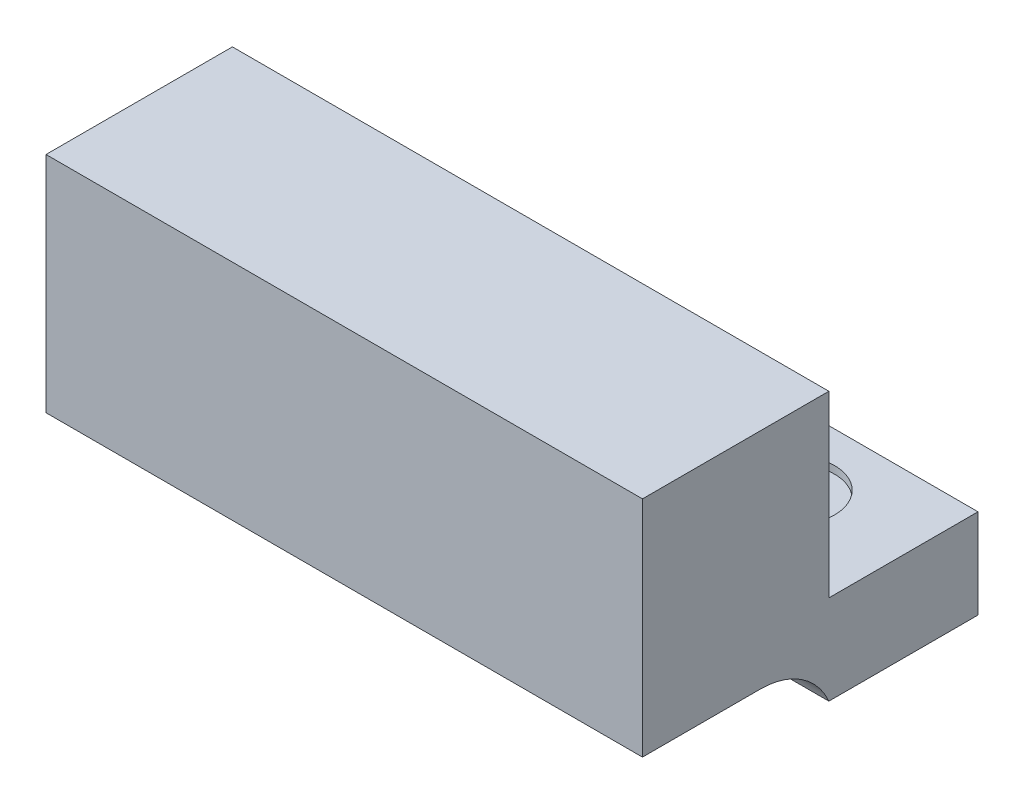
ISO-10303-21;
HEADER;
FILE_DESCRIPTION(('STEP AP214'),'2;1');
FILE_NAME('part.step','',(''),(''),'','','');
FILE_SCHEMA(('AUTOMOTIVE_DESIGN { 1 0 10303 214 1 1 1 1 }'));
ENDSEC;
DATA;
#1=APPLICATION_CONTEXT('core data for automotive mechanical design processes');
#2=APPLICATION_PROTOCOL_DEFINITION('international standard','automotive_design',2000,#1);
#3=PRODUCT_CONTEXT('',#1,'mechanical');
#4=PRODUCT('Part','Part','',(#3));
#5=PRODUCT_RELATED_PRODUCT_CATEGORY('part','',(#4));
#6=PRODUCT_DEFINITION_FORMATION('','',#4);
#7=PRODUCT_DEFINITION_CONTEXT('part definition',#1,'design');
#8=PRODUCT_DEFINITION('design','',#6,#7);
#9=PRODUCT_DEFINITION_SHAPE('','',#8);
#10=(LENGTH_UNIT() NAMED_UNIT(*) SI_UNIT(.MILLI.,.METRE.));
#11=(NAMED_UNIT(*) PLANE_ANGLE_UNIT() SI_UNIT($,.RADIAN.));
#12=(NAMED_UNIT(*) SI_UNIT($,.STERADIAN.) SOLID_ANGLE_UNIT());
#13=UNCERTAINTY_MEASURE_WITH_UNIT(LENGTH_MEASURE(1.E-05),#10,'distance_accuracy_value','');
#14=(GEOMETRIC_REPRESENTATION_CONTEXT(3) GLOBAL_UNCERTAINTY_ASSIGNED_CONTEXT((#13)) GLOBAL_UNIT_ASSIGNED_CONTEXT((#10,
#11,#12)) REPRESENTATION_CONTEXT('',''));
#15=CARTESIAN_POINT('',(0.,0.,0.));
#16=DIRECTION('',(0.,0.,1.));
#17=DIRECTION('',(1.,0.,0.));
#18=AXIS2_PLACEMENT_3D('',#15,#16,#17);
#19=CARTESIAN_POINT('',(0.,17.88424326,-20.));
#20=DIRECTION('',(0.,1.,0.));
#21=DIRECTION('',(0.,0.,1.));
#22=AXIS2_PLACEMENT_3D('',#19,#20,#21);
#23=PLANE('',#22);
#24=CARTESIAN_POINT('',(-9.08830476000388,17.88424326,-10.));
#25=DIRECTION('',(0.,-1.,0.));
#26=DIRECTION('',(0.,0.,-1.));
#27=AXIS2_PLACEMENT_3D('',#24,#25,#26);
#28=CIRCLE('',#27,3.);
#29=CARTESIAN_POINT('',(-9.08830476000388,17.88424326,-13.));
#30=VERTEX_POINT('',#29);
#31=EDGE_CURVE('E305',#30,#30,#28,.T.);
#32=ORIENTED_EDGE('',*,*,#31,.F.);
#33=EDGE_LOOP('',(#32));
#34=FACE_BOUND('',#33,.T.);
#35=CARTESIAN_POINT('',(5.91169523999612,17.88424326,-10.));
#36=DIRECTION('',(0.,-1.,0.));
#37=DIRECTION('',(0.,0.,-1.));
#38=AXIS2_PLACEMENT_3D('',#35,#36,#37);
#39=CIRCLE('',#38,2.99999999999999);
#40=CARTESIAN_POINT('',(5.91169523999612,17.88424326,-13.));
#41=VERTEX_POINT('',#40);
#42=EDGE_CURVE('E311',#41,#41,#39,.T.);
#43=ORIENTED_EDGE('',*,*,#42,.F.);
#44=EDGE_LOOP('',(#43));
#45=FACE_BOUND('',#44,.T.);
#46=DIRECTION('',(-1.,0.,0.));
#47=VECTOR('',#46,1.);
#48=CARTESIAN_POINT('',(0.,17.88424326,0.));
#49=LINE('',#48,#47);
#50=CARTESIAN_POINT('',(20.9116952399961,17.88424326,0.));
#51=VERTEX_POINT('',#50);
#52=CARTESIAN_POINT('',(-59.0883047600039,17.88424326,0.));
#53=VERTEX_POINT('',#52);
#54=EDGE_CURVE('E135',#51,#53,#49,.T.);
#55=ORIENTED_EDGE('',*,*,#54,.T.);
#56=DIRECTION('',(0.,0.,1.));
#57=VECTOR('',#56,1.);
#58=CARTESIAN_POINT('',(-59.0883047600039,17.88424326,-20.));
#59=LINE('',#58,#57);
#60=CARTESIAN_POINT('',(-59.0883047600039,17.88424326,-20.));
#61=VERTEX_POINT('',#60);
#62=EDGE_CURVE('E153',#61,#53,#59,.T.);
#63=ORIENTED_EDGE('',*,*,#62,.F.);
#64=DIRECTION('',(-1.,0.,0.));
#65=VECTOR('',#64,1.);
#66=CARTESIAN_POINT('',(0.,17.88424326,-20.));
#67=LINE('',#66,#65);
#68=CARTESIAN_POINT('',(20.9116952399961,17.88424326,-20.));
#69=VERTEX_POINT('',#68);
#70=EDGE_CURVE('E128',#69,#61,#67,.T.);
#71=ORIENTED_EDGE('',*,*,#70,.F.);
#72=DIRECTION('',(0.,0.,1.));
#73=VECTOR('',#72,1.);
#74=CARTESIAN_POINT('',(20.9116952399961,17.88424326,-20.));
#75=LINE('',#74,#73);
#76=EDGE_CURVE('E118',#69,#51,#75,.T.);
#77=ORIENTED_EDGE('',*,*,#76,.T.);
#78=EDGE_LOOP('',(#55,#63,#71,#77));
#79=FACE_BOUND('',#78,.T.);
#80=CARTESIAN_POINT('',(-29.0883047600039,17.88424326,-10.));
#81=DIRECTION('',(0.,-1.,0.));
#82=DIRECTION('',(0.,0.,-1.));
#83=AXIS2_PLACEMENT_3D('',#80,#81,#82);
#84=CIRCLE('',#83,3.);
#85=CARTESIAN_POINT('',(-29.0883047600039,17.88424326,-13.));
#86=VERTEX_POINT('',#85);
#87=EDGE_CURVE('E297',#86,#86,#84,.F.);
#88=ORIENTED_EDGE('',*,*,#87,.T.);
#89=EDGE_LOOP('',(#88));
#90=FACE_BOUND('',#89,.T.);
#91=CARTESIAN_POINT('',(-44.0883047600039,17.88424326,-10.));
#92=DIRECTION('',(0.,-1.,0.));
#93=DIRECTION('',(0.,0.,-1.));
#94=AXIS2_PLACEMENT_3D('',#91,#92,#93);
#95=CIRCLE('',#94,2.99999999999999);
#96=CARTESIAN_POINT('',(-44.0883047600039,17.88424326,-13.));
#97=VERTEX_POINT('',#96);
#98=EDGE_CURVE('E293',#97,#97,#95,.F.);
#99=ORIENTED_EDGE('',*,*,#98,.T.);
#100=EDGE_LOOP('',(#99));
#101=FACE_BOUND('',#100,.T.);
#102=ADVANCED_FACE('F41',(#34,#45,#79,#90,#101),#23,.F.);
#103=CARTESIAN_POINT('',(-59.0883047600039,53.88424326,25.));
#104=DIRECTION('',(1.,0.,0.));
#105=DIRECTION('',(0.,0.,-1.));
#106=AXIS2_PLACEMENT_3D('',#103,#104,#105);
#107=PLANE('',#106);
#108=DIRECTION('',(0.,-1.,0.));
#109=VECTOR('',#108,1.);
#110=CARTESIAN_POINT('',(-59.0883047600039,53.88424326,0.));
#111=LINE('',#110,#109);
#112=CARTESIAN_POINT('',(-59.0883047600039,53.88424326,0.));
#113=VERTEX_POINT('',#112);
#114=CARTESIAN_POINT('',(-59.0883047600039,29.88424326,0.));
#115=VERTEX_POINT('',#114);
#116=EDGE_CURVE('E117',#113,#115,#111,.T.);
#117=ORIENTED_EDGE('',*,*,#116,.T.);
#118=DIRECTION('',(0.,0.,1.));
#119=VECTOR('',#118,1.);
#120=CARTESIAN_POINT('',(-59.0883047600039,29.88424326,-20.));
#121=LINE('',#120,#119);
#122=CARTESIAN_POINT('',(-59.0883047600039,29.88424326,-20.));
#123=VERTEX_POINT('',#122);
#124=EDGE_CURVE('E147',#123,#115,#121,.T.);
#125=ORIENTED_EDGE('',*,*,#124,.F.);
#126=DIRECTION('',(0.,1.,0.));
#127=VECTOR('',#126,1.);
#128=CARTESIAN_POINT('',(-59.0883047600039,0.,-20.));
#129=LINE('',#128,#127);
#130=EDGE_CURVE('E132',#61,#123,#129,.T.);
#131=ORIENTED_EDGE('',*,*,#130,.F.);
#132=ORIENTED_EDGE('',*,*,#62,.T.);
#133=CARTESIAN_POINT('',(-59.0883047600039,13.88424326,9.16515138991168));
#134=DIRECTION('',(1.,0.,0.));
#135=DIRECTION('',(0.,0.,-1.));
#136=AXIS2_PLACEMENT_3D('',#133,#134,#135);
#137=CIRCLE('',#136,10.);
#138=CARTESIAN_POINT('',(-59.0883047600039,23.88424326,9.16515138991168));
#139=VERTEX_POINT('',#138);
#140=EDGE_CURVE('E11',#53,#139,#137,.T.);
#141=ORIENTED_EDGE('',*,*,#140,.T.);
#142=DIRECTION('',(0.,0.,-1.));
#143=VECTOR('',#142,1.);
#144=CARTESIAN_POINT('',(-59.0883047600039,23.88424326,25.));
#145=LINE('',#144,#143);
#146=CARTESIAN_POINT('',(-59.0883047600039,23.88424326,25.));
#147=VERTEX_POINT('',#146);
#148=EDGE_CURVE('E191',#147,#139,#145,.T.);
#149=ORIENTED_EDGE('',*,*,#148,.F.);
#150=DIRECTION('',(0.,-1.,0.));
#151=VECTOR('',#150,1.);
#152=CARTESIAN_POINT('',(-59.0883047600039,53.88424326,25.));
#153=LINE('',#152,#151);
#154=CARTESIAN_POINT('',(-59.0883047600039,53.88424326,25.));
#155=VERTEX_POINT('',#154);
#156=EDGE_CURVE('E158',#155,#147,#153,.T.);
#157=ORIENTED_EDGE('',*,*,#156,.F.);
#158=DIRECTION('',(0.,0.,-1.));
#159=VECTOR('',#158,1.);
#160=CARTESIAN_POINT('',(-59.0883047600039,53.88424326,25.));
#161=LINE('',#160,#159);
#162=EDGE_CURVE('E172',#155,#113,#161,.T.);
#163=ORIENTED_EDGE('',*,*,#162,.T.);
#164=EDGE_LOOP('',(#117,#125,#131,#132,#141,#149,#157,#163));
#165=FACE_BOUND('',#164,.T.);
#166=ADVANCED_FACE('F205',(#165),#107,.F.);
#167=CARTESIAN_POINT('',(-59.0883047600039,23.88424326,25.));
#168=DIRECTION('',(0.,1.,0.));
#169=DIRECTION('',(0.,0.,1.));
#170=AXIS2_PLACEMENT_3D('',#167,#168,#169);
#171=PLANE('',#170);
#172=ORIENTED_EDGE('',*,*,#148,.T.);
#173=DIRECTION('',(1.,0.,0.));
#174=VECTOR('',#173,1.);
#175=CARTESIAN_POINT('',(-59.0883047600039,23.88424326,9.16515138991168));
#176=LINE('',#175,#174);
#177=CARTESIAN_POINT('',(20.9116952399961,23.88424326,9.16515138991168));
#178=VERTEX_POINT('',#177);
#179=EDGE_CURVE('E194',#139,#178,#176,.T.);
#180=ORIENTED_EDGE('',*,*,#179,.T.);
#181=DIRECTION('',(0.,0.,-1.));
#182=VECTOR('',#181,1.);
#183=CARTESIAN_POINT('',(20.9116952399961,23.88424326,25.));
#184=LINE('',#183,#182);
#185=CARTESIAN_POINT('',(20.9116952399961,23.88424326,25.));
#186=VERTEX_POINT('',#185);
#187=EDGE_CURVE('E188',#186,#178,#184,.T.);
#188=ORIENTED_EDGE('',*,*,#187,.F.);
#189=DIRECTION('',(1.,0.,0.));
#190=VECTOR('',#189,1.);
#191=CARTESIAN_POINT('',(-59.0883047600039,23.88424326,25.));
#192=LINE('',#191,#190);
#193=EDGE_CURVE('E162',#147,#186,#192,.T.);
#194=ORIENTED_EDGE('',*,*,#193,.F.);
#195=EDGE_LOOP('',(#172,#180,#188,#194));
#196=FACE_BOUND('',#195,.T.);
#197=ADVANCED_FACE('F203',(#196),#171,.F.);
#198=CARTESIAN_POINT('',(20.9116952399961,53.88424326,25.));
#199=DIRECTION('',(-1.,0.,0.));
#200=DIRECTION('',(0.,0.,1.));
#201=AXIS2_PLACEMENT_3D('',#198,#199,#200);
#202=PLANE('',#201);
#203=ORIENTED_EDGE('',*,*,#187,.T.);
#204=CARTESIAN_POINT('',(20.9116952399961,13.88424326,9.16515138991168));
#205=DIRECTION('',(-1.,0.,0.));
#206=DIRECTION('',(0.,0.,1.));
#207=AXIS2_PLACEMENT_3D('',#204,#205,#206);
#208=CIRCLE('',#207,10.);
#209=EDGE_CURVE('E50',#178,#51,#208,.T.);
#210=ORIENTED_EDGE('',*,*,#209,.T.);
#211=ORIENTED_EDGE('',*,*,#76,.F.);
#212=DIRECTION('',(0.,-1.,0.));
#213=VECTOR('',#212,1.);
#214=CARTESIAN_POINT('',(20.9116952399961,0.,-20.));
#215=LINE('',#214,#213);
#216=CARTESIAN_POINT('',(20.9116952399961,29.88424326,-20.));
#217=VERTEX_POINT('',#216);
#218=EDGE_CURVE('E121',#217,#69,#215,.T.);
#219=ORIENTED_EDGE('',*,*,#218,.F.);
#220=DIRECTION('',(0.,0.,1.));
#221=VECTOR('',#220,1.);
#222=CARTESIAN_POINT('',(20.9116952399961,29.88424326,-20.));
#223=LINE('',#222,#221);
#224=CARTESIAN_POINT('',(20.9116952399961,29.88424326,0.));
#225=VERTEX_POINT('',#224);
#226=EDGE_CURVE('E107',#217,#225,#223,.T.);
#227=ORIENTED_EDGE('',*,*,#226,.T.);
#228=DIRECTION('',(0.,1.,0.));
#229=VECTOR('',#228,1.);
#230=CARTESIAN_POINT('',(20.9116952399961,53.88424326,0.));
#231=LINE('',#230,#229);
#232=CARTESIAN_POINT('',(20.9116952399961,53.88424326,0.));
#233=VERTEX_POINT('',#232);
#234=EDGE_CURVE('E176',#225,#233,#231,.T.);
#235=ORIENTED_EDGE('',*,*,#234,.T.);
#236=DIRECTION('',(0.,0.,-1.));
#237=VECTOR('',#236,1.);
#238=CARTESIAN_POINT('',(20.9116952399961,53.88424326,25.));
#239=LINE('',#238,#237);
#240=CARTESIAN_POINT('',(20.9116952399961,53.88424326,25.));
#241=VERTEX_POINT('',#240);
#242=EDGE_CURVE('E184',#241,#233,#239,.T.);
#243=ORIENTED_EDGE('',*,*,#242,.F.);
#244=DIRECTION('',(0.,1.,0.));
#245=VECTOR('',#244,1.);
#246=CARTESIAN_POINT('',(20.9116952399961,53.88424326,25.));
#247=LINE('',#246,#245);
#248=EDGE_CURVE('E166',#186,#241,#247,.T.);
#249=ORIENTED_EDGE('',*,*,#248,.F.);
#250=EDGE_LOOP('',(#203,#210,#211,#219,#227,#235,#243,#249));
#251=FACE_BOUND('',#250,.T.);
#252=ADVANCED_FACE('F123',(#251),#202,.F.);
#253=CARTESIAN_POINT('',(-59.0883047600039,53.88424326,25.));
#254=DIRECTION('',(0.,-1.,0.));
#255=DIRECTION('',(0.,0.,-1.));
#256=AXIS2_PLACEMENT_3D('',#253,#254,#255);
#257=PLANE('',#256);
#258=DIRECTION('',(-1.,0.,0.));
#259=VECTOR('',#258,1.);
#260=CARTESIAN_POINT('',(-59.0883047600039,53.88424326,0.));
#261=LINE('',#260,#259);
#262=EDGE_CURVE('E163',#233,#113,#261,.T.);
#263=ORIENTED_EDGE('',*,*,#262,.T.);
#264=ORIENTED_EDGE('',*,*,#162,.F.);
#265=DIRECTION('',(-1.,0.,0.));
#266=VECTOR('',#265,1.);
#267=CARTESIAN_POINT('',(-59.0883047600039,53.88424326,25.));
#268=LINE('',#267,#266);
#269=EDGE_CURVE('E169',#241,#155,#268,.T.);
#270=ORIENTED_EDGE('',*,*,#269,.F.);
#271=ORIENTED_EDGE('',*,*,#242,.T.);
#272=EDGE_LOOP('',(#263,#264,#270,#271));
#273=FACE_BOUND('',#272,.T.);
#274=ADVANCED_FACE('F213',(#273),#257,.F.);
#275=CARTESIAN_POINT('',(0.,0.,25.));
#276=DIRECTION('',(0.,0.,1.));
#277=DIRECTION('',(1.,0.,0.));
#278=AXIS2_PLACEMENT_3D('',#275,#276,#277);
#279=PLANE('',#278);
#280=ORIENTED_EDGE('',*,*,#156,.T.);
#281=ORIENTED_EDGE('',*,*,#193,.T.);
#282=ORIENTED_EDGE('',*,*,#248,.T.);
#283=ORIENTED_EDGE('',*,*,#269,.T.);
#284=EDGE_LOOP('',(#280,#281,#282,#283));
#285=FACE_BOUND('',#284,.T.);
#286=ADVANCED_FACE('F209',(#285),#279,.T.);
#287=CARTESIAN_POINT('',(0.,0.,0.));
#288=DIRECTION('',(0.,0.,1.));
#289=DIRECTION('',(1.,0.,0.));
#290=AXIS2_PLACEMENT_3D('',#287,#288,#289);
#291=PLANE('',#290);
#292=ORIENTED_EDGE('',*,*,#234,.F.);
#293=DIRECTION('',(-1.,0.,0.));
#294=VECTOR('',#293,1.);
#295=CARTESIAN_POINT('',(0.,29.88424326,0.));
#296=LINE('',#295,#294);
#297=EDGE_CURVE('E113',#225,#115,#296,.T.);
#298=ORIENTED_EDGE('',*,*,#297,.T.);
#299=ORIENTED_EDGE('',*,*,#116,.F.);
#300=ORIENTED_EDGE('',*,*,#262,.F.);
#301=EDGE_LOOP('',(#292,#298,#299,#300));
#302=FACE_BOUND('',#301,.T.);
#303=ADVANCED_FACE('F216',(#302),#291,.F.);
#304=CARTESIAN_POINT('',(0.,29.88424326,-20.));
#305=DIRECTION('',(0.,1.,0.));
#306=DIRECTION('',(0.,0.,1.));
#307=AXIS2_PLACEMENT_3D('',#304,#305,#306);
#308=PLANE('',#307);
#309=CARTESIAN_POINT('',(5.91169523999612,29.88424326,-10.));
#310=DIRECTION('',(0.,1.,0.));
#311=DIRECTION('',(0.,0.,1.));
#312=AXIS2_PLACEMENT_3D('',#309,#310,#311);
#313=CIRCLE('',#312,5.75);
#314=CARTESIAN_POINT('',(5.91169523999612,29.88424326,-4.25));
#315=VERTEX_POINT('',#314);
#316=EDGE_CURVE('E328',#315,#315,#313,.T.);
#317=ORIENTED_EDGE('',*,*,#316,.F.);
#318=EDGE_LOOP('',(#317));
#319=FACE_BOUND('',#318,.T.);
#320=CARTESIAN_POINT('',(-29.0883047600039,29.88424326,-10.));
#321=DIRECTION('',(0.,1.,0.));
#322=DIRECTION('',(0.,0.,1.));
#323=AXIS2_PLACEMENT_3D('',#320,#321,#322);
#324=CIRCLE('',#323,5.75);
#325=CARTESIAN_POINT('',(-29.0883047600039,29.88424326,-4.25));
#326=VERTEX_POINT('',#325);
#327=EDGE_CURVE('E324',#326,#326,#324,.T.);
#328=ORIENTED_EDGE('',*,*,#327,.F.);
#329=EDGE_LOOP('',(#328));
#330=FACE_BOUND('',#329,.T.);
#331=CARTESIAN_POINT('',(-44.0883047600039,29.88424326,-10.));
#332=DIRECTION('',(0.,1.,0.));
#333=DIRECTION('',(0.,0.,1.));
#334=AXIS2_PLACEMENT_3D('',#331,#332,#333);
#335=CIRCLE('',#334,5.75);
#336=CARTESIAN_POINT('',(-44.0883047600039,29.88424326,-4.25));
#337=VERTEX_POINT('',#336);
#338=EDGE_CURVE('E140',#337,#337,#335,.T.);
#339=ORIENTED_EDGE('',*,*,#338,.F.);
#340=EDGE_LOOP('',(#339));
#341=FACE_BOUND('',#340,.T.);
#342=CARTESIAN_POINT('',(-9.08830476000388,29.88424326,-10.));
#343=DIRECTION('',(0.,1.,0.));
#344=DIRECTION('',(0.,0.,1.));
#345=AXIS2_PLACEMENT_3D('',#342,#343,#344);
#346=CIRCLE('',#345,5.75);
#347=CARTESIAN_POINT('',(-9.08830476000388,29.88424326,-4.25));
#348=VERTEX_POINT('',#347);
#349=EDGE_CURVE('E343',#348,#348,#346,.T.);
#350=ORIENTED_EDGE('',*,*,#349,.F.);
#351=EDGE_LOOP('',(#350));
#352=FACE_BOUND('',#351,.T.);
#353=ORIENTED_EDGE('',*,*,#297,.F.);
#354=ORIENTED_EDGE('',*,*,#226,.F.);
#355=DIRECTION('',(-1.,0.,0.));
#356=VECTOR('',#355,1.);
#357=CARTESIAN_POINT('',(0.,29.88424326,-20.));
#358=LINE('',#357,#356);
#359=EDGE_CURVE('E111',#217,#123,#358,.T.);
#360=ORIENTED_EDGE('',*,*,#359,.T.);
#361=ORIENTED_EDGE('',*,*,#124,.T.);
#362=EDGE_LOOP('',(#353,#354,#360,#361));
#363=FACE_BOUND('',#362,.T.);
#364=ADVANCED_FACE('F109',(#319,#330,#341,#352,#363),#308,.T.);
#365=CARTESIAN_POINT('',(0.,0.,-20.));
#366=DIRECTION('',(0.,0.,-1.));
#367=DIRECTION('',(-1.,0.,0.));
#368=AXIS2_PLACEMENT_3D('',#365,#366,#367);
#369=PLANE('',#368);
#370=ORIENTED_EDGE('',*,*,#359,.F.);
#371=ORIENTED_EDGE('',*,*,#218,.T.);
#372=ORIENTED_EDGE('',*,*,#70,.T.);
#373=ORIENTED_EDGE('',*,*,#130,.T.);
#374=EDGE_LOOP('',(#370,#371,#372,#373));
#375=FACE_BOUND('',#374,.T.);
#376=ADVANCED_FACE('F130',(#375),#369,.T.);
#377=CARTESIAN_POINT('',(0.,13.88424326,9.16515138991168));
#378=DIRECTION('',(1.,0.,0.));
#379=DIRECTION('',(0.,0.,-1.));
#380=AXIS2_PLACEMENT_3D('',#377,#378,#379);
#381=CYLINDRICAL_SURFACE('',#380,10.);
#382=ORIENTED_EDGE('',*,*,#140,.F.);
#383=ORIENTED_EDGE('',*,*,#54,.F.);
#384=ORIENTED_EDGE('',*,*,#209,.F.);
#385=ORIENTED_EDGE('',*,*,#179,.F.);
#386=EDGE_LOOP('',(#382,#383,#384,#385));
#387=FACE_BOUND('',#386,.T.);
#388=ADVANCED_FACE('F43',(#387),#381,.F.);
#389=CARTESIAN_POINT('',(-9.08830476000388,28.88424326,-10.));
#390=DIRECTION('',(0.,1.,0.));
#391=DIRECTION('',(0.,0.,1.));
#392=AXIS2_PLACEMENT_3D('',#389,#390,#391);
#393=CYLINDRICAL_SURFACE('',#392,5.75);
#394=CARTESIAN_POINT('',(-9.08830476000388,28.88424326,-10.));
#395=DIRECTION('',(0.,1.,0.));
#396=DIRECTION('',(0.,0.,1.));
#397=AXIS2_PLACEMENT_3D('',#394,#395,#396);
#398=CIRCLE('',#397,5.75);
#399=CARTESIAN_POINT('',(-9.08830476000388,28.88424326,-4.25));
#400=VERTEX_POINT('',#399);
#401=EDGE_CURVE('E332',#400,#400,#398,.T.);
#402=ORIENTED_EDGE('',*,*,#401,.F.);
#403=EDGE_LOOP('',(#402));
#404=FACE_BOUND('',#403,.T.);
#405=ORIENTED_EDGE('',*,*,#349,.T.);
#406=EDGE_LOOP('',(#405));
#407=FACE_BOUND('',#406,.T.);
#408=ADVANCED_FACE('F248',(#404,#407),#393,.F.);
#409=CARTESIAN_POINT('',(-9.08830476000388,28.88424326,-10.));
#410=DIRECTION('',(0.,1.,0.));
#411=DIRECTION('',(0.,0.,1.));
#412=AXIS2_PLACEMENT_3D('',#409,#410,#411);
#413=PLANE('',#412);
#414=CARTESIAN_POINT('',(-9.08830476000388,28.88424326,-10.));
#415=DIRECTION('',(0.,1.,0.));
#416=DIRECTION('',(0.,0.,1.));
#417=AXIS2_PLACEMENT_3D('',#414,#415,#416);
#418=CIRCLE('',#417,3.);
#419=CARTESIAN_POINT('',(-9.08830476000388,28.88424326,-7.));
#420=VERTEX_POINT('',#419);
#421=EDGE_CURVE('E320',#420,#420,#418,.T.);
#422=ORIENTED_EDGE('',*,*,#421,.F.);
#423=EDGE_LOOP('',(#422));
#424=FACE_BOUND('',#423,.T.);
#425=ORIENTED_EDGE('',*,*,#401,.T.);
#426=EDGE_LOOP('',(#425));
#427=FACE_BOUND('',#426,.T.);
#428=ADVANCED_FACE('F242',(#424,#427),#413,.T.);
#429=CARTESIAN_POINT('',(-44.0883047600039,28.88424326,-10.));
#430=DIRECTION('',(0.,1.,0.));
#431=DIRECTION('',(0.,0.,1.));
#432=AXIS2_PLACEMENT_3D('',#429,#430,#431);
#433=CYLINDRICAL_SURFACE('',#432,5.75);
#434=CARTESIAN_POINT('',(-44.0883047600039,28.88424326,-10.));
#435=DIRECTION('',(0.,1.,0.));
#436=DIRECTION('',(0.,0.,1.));
#437=AXIS2_PLACEMENT_3D('',#434,#435,#436);
#438=CIRCLE('',#437,5.75);
#439=CARTESIAN_POINT('',(-44.0883047600039,28.88424326,-4.25));
#440=VERTEX_POINT('',#439);
#441=EDGE_CURVE('E346',#440,#440,#438,.T.);
#442=ORIENTED_EDGE('',*,*,#441,.F.);
#443=EDGE_LOOP('',(#442));
#444=FACE_BOUND('',#443,.T.);
#445=ORIENTED_EDGE('',*,*,#338,.T.);
#446=EDGE_LOOP('',(#445));
#447=FACE_BOUND('',#446,.T.);
#448=ADVANCED_FACE('F238',(#444,#447),#433,.F.);
#449=CARTESIAN_POINT('',(-44.0883047600039,28.88424326,-10.));
#450=DIRECTION('',(0.,1.,0.));
#451=DIRECTION('',(0.,0.,1.));
#452=AXIS2_PLACEMENT_3D('',#449,#450,#451);
#453=PLANE('',#452);
#454=CARTESIAN_POINT('',(-44.0883047600039,28.88424326,-10.));
#455=DIRECTION('',(0.,1.,0.));
#456=DIRECTION('',(0.,0.,1.));
#457=AXIS2_PLACEMENT_3D('',#454,#455,#456);
#458=CIRCLE('',#457,2.99999999999999);
#459=CARTESIAN_POINT('',(-44.0883047600039,28.88424326,-7.00000000000001));
#460=VERTEX_POINT('',#459);
#461=EDGE_CURVE('E290',#460,#460,#458,.F.);
#462=ORIENTED_EDGE('',*,*,#461,.T.);
#463=EDGE_LOOP('',(#462));
#464=FACE_BOUND('',#463,.T.);
#465=ORIENTED_EDGE('',*,*,#441,.T.);
#466=EDGE_LOOP('',(#465));
#467=FACE_BOUND('',#466,.T.);
#468=ADVANCED_FACE('F241',(#464,#467),#453,.T.);
#469=CARTESIAN_POINT('',(-29.0883047600039,28.88424326,-10.));
#470=DIRECTION('',(0.,1.,0.));
#471=DIRECTION('',(0.,0.,1.));
#472=AXIS2_PLACEMENT_3D('',#469,#470,#471);
#473=CYLINDRICAL_SURFACE('',#472,5.75);
#474=CARTESIAN_POINT('',(-29.0883047600039,28.88424326,-10.));
#475=DIRECTION('',(0.,1.,0.));
#476=DIRECTION('',(0.,0.,1.));
#477=AXIS2_PLACEMENT_3D('',#474,#475,#476);
#478=CIRCLE('',#477,5.75);
#479=CARTESIAN_POINT('',(-29.0883047600039,28.88424326,-4.25));
#480=VERTEX_POINT('',#479);
#481=EDGE_CURVE('E333',#480,#480,#478,.T.);
#482=ORIENTED_EDGE('',*,*,#481,.F.);
#483=EDGE_LOOP('',(#482));
#484=FACE_BOUND('',#483,.T.);
#485=ORIENTED_EDGE('',*,*,#327,.T.);
#486=EDGE_LOOP('',(#485));
#487=FACE_BOUND('',#486,.T.);
#488=ADVANCED_FACE('F246',(#484,#487),#473,.F.);
#489=CARTESIAN_POINT('',(-29.0883047600039,28.88424326,-10.));
#490=DIRECTION('',(0.,1.,0.));
#491=DIRECTION('',(0.,0.,1.));
#492=AXIS2_PLACEMENT_3D('',#489,#490,#491);
#493=PLANE('',#492);
#494=CARTESIAN_POINT('',(-29.0883047600039,28.88424326,-10.));
#495=DIRECTION('',(0.,1.,0.));
#496=DIRECTION('',(0.,0.,1.));
#497=AXIS2_PLACEMENT_3D('',#494,#495,#496);
#498=CIRCLE('',#497,3.);
#499=CARTESIAN_POINT('',(-29.0883047600039,28.88424326,-7.));
#500=VERTEX_POINT('',#499);
#501=EDGE_CURVE('E302',#500,#500,#498,.F.);
#502=ORIENTED_EDGE('',*,*,#501,.T.);
#503=EDGE_LOOP('',(#502));
#504=FACE_BOUND('',#503,.T.);
#505=ORIENTED_EDGE('',*,*,#481,.T.);
#506=EDGE_LOOP('',(#505));
#507=FACE_BOUND('',#506,.T.);
#508=ADVANCED_FACE('F257',(#504,#507),#493,.T.);
#509=CARTESIAN_POINT('',(5.91169523999612,28.88424326,-10.));
#510=DIRECTION('',(0.,1.,0.));
#511=DIRECTION('',(0.,0.,1.));
#512=AXIS2_PLACEMENT_3D('',#509,#510,#511);
#513=CYLINDRICAL_SURFACE('',#512,5.75);
#514=CARTESIAN_POINT('',(5.91169523999612,28.88424326,-10.));
#515=DIRECTION('',(0.,1.,0.));
#516=DIRECTION('',(0.,0.,1.));
#517=AXIS2_PLACEMENT_3D('',#514,#515,#516);
#518=CIRCLE('',#517,5.75);
#519=CARTESIAN_POINT('',(5.91169523999612,28.88424326,-4.25));
#520=VERTEX_POINT('',#519);
#521=EDGE_CURVE('E149',#520,#520,#518,.T.);
#522=ORIENTED_EDGE('',*,*,#521,.F.);
#523=EDGE_LOOP('',(#522));
#524=FACE_BOUND('',#523,.T.);
#525=ORIENTED_EDGE('',*,*,#316,.T.);
#526=EDGE_LOOP('',(#525));
#527=FACE_BOUND('',#526,.T.);
#528=ADVANCED_FACE('F261',(#524,#527),#513,.F.);
#529=CARTESIAN_POINT('',(5.91169523999612,28.88424326,-10.));
#530=DIRECTION('',(0.,1.,0.));
#531=DIRECTION('',(0.,0.,1.));
#532=AXIS2_PLACEMENT_3D('',#529,#530,#531);
#533=PLANE('',#532);
#534=CARTESIAN_POINT('',(5.91169523999612,28.88424326,-10.));
#535=DIRECTION('',(0.,1.,0.));
#536=DIRECTION('',(0.,0.,1.));
#537=AXIS2_PLACEMENT_3D('',#534,#535,#536);
#538=CIRCLE('',#537,2.99999999999999);
#539=CARTESIAN_POINT('',(5.91169523999612,28.88424326,-7.00000000000001));
#540=VERTEX_POINT('',#539);
#541=EDGE_CURVE('E296',#540,#540,#538,.T.);
#542=ORIENTED_EDGE('',*,*,#541,.F.);
#543=EDGE_LOOP('',(#542));
#544=FACE_BOUND('',#543,.T.);
#545=ORIENTED_EDGE('',*,*,#521,.T.);
#546=EDGE_LOOP('',(#545));
#547=FACE_BOUND('',#546,.T.);
#548=ADVANCED_FACE('F265',(#544,#547),#533,.T.);
#549=CARTESIAN_POINT('',(5.91169523999612,53.88424326,-10.));
#550=DIRECTION('',(0.,-1.,0.));
#551=DIRECTION('',(0.,0.,-1.));
#552=AXIS2_PLACEMENT_3D('',#549,#550,#551);
#553=CYLINDRICAL_SURFACE('',#552,2.99999999999999);
#554=ORIENTED_EDGE('',*,*,#541,.T.);
#555=EDGE_LOOP('',(#554));
#556=FACE_BOUND('',#555,.T.);
#557=ORIENTED_EDGE('',*,*,#42,.T.);
#558=EDGE_LOOP('',(#557));
#559=FACE_BOUND('',#558,.T.);
#560=ADVANCED_FACE('F269',(#556,#559),#553,.F.);
#561=CARTESIAN_POINT('',(-29.0883047600039,53.88424326,-10.));
#562=DIRECTION('',(0.,-1.,0.));
#563=DIRECTION('',(0.,0.,-1.));
#564=AXIS2_PLACEMENT_3D('',#561,#562,#563);
#565=CYLINDRICAL_SURFACE('',#564,3.);
#566=ORIENTED_EDGE('',*,*,#501,.F.);
#567=EDGE_LOOP('',(#566));
#568=FACE_BOUND('',#567,.T.);
#569=ORIENTED_EDGE('',*,*,#87,.F.);
#570=EDGE_LOOP('',(#569));
#571=FACE_BOUND('',#570,.T.);
#572=ADVANCED_FACE('F273',(#568,#571),#565,.F.);
#573=CARTESIAN_POINT('',(-44.0883047600039,53.88424326,-10.));
#574=DIRECTION('',(0.,-1.,0.));
#575=DIRECTION('',(0.,0.,-1.));
#576=AXIS2_PLACEMENT_3D('',#573,#574,#575);
#577=CYLINDRICAL_SURFACE('',#576,2.99999999999999);
#578=ORIENTED_EDGE('',*,*,#461,.F.);
#579=EDGE_LOOP('',(#578));
#580=FACE_BOUND('',#579,.T.);
#581=ORIENTED_EDGE('',*,*,#98,.F.);
#582=EDGE_LOOP('',(#581));
#583=FACE_BOUND('',#582,.T.);
#584=ADVANCED_FACE('F278',(#580,#583),#577,.F.);
#585=CARTESIAN_POINT('',(-9.08830476000388,53.88424326,-10.));
#586=DIRECTION('',(0.,-1.,0.));
#587=DIRECTION('',(0.,0.,-1.));
#588=AXIS2_PLACEMENT_3D('',#585,#586,#587);
#589=CYLINDRICAL_SURFACE('',#588,3.);
#590=ORIENTED_EDGE('',*,*,#421,.T.);
#591=EDGE_LOOP('',(#590));
#592=FACE_BOUND('',#591,.T.);
#593=ORIENTED_EDGE('',*,*,#31,.T.);
#594=EDGE_LOOP('',(#593));
#595=FACE_BOUND('',#594,.T.);
#596=ADVANCED_FACE('F275',(#592,#595),#589,.F.);
#597=CLOSED_SHELL('',(#102,#166,#197,#252,#274,#286,#303,#364,#376,#388,#408,#428,#448,#468,
#488,#508,#528,#548,#560,#572,#584,#596));
#598=MANIFOLD_SOLID_BREP('B2',#597);
#599=ADVANCED_BREP_SHAPE_REPRESENTATION('',(#18,#598),#14);
#600=SHAPE_DEFINITION_REPRESENTATION(#9,#599);
ENDSEC;
END-ISO-10303-21;
